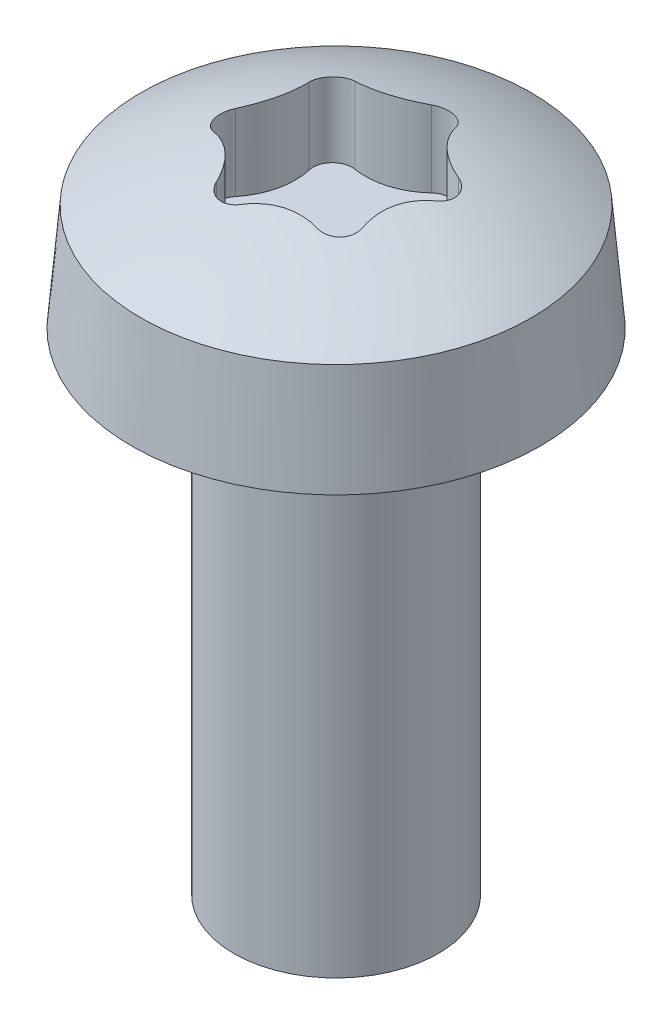
ISO-10303-21;
HEADER;
FILE_DESCRIPTION(('STEP AP214'),'2;1');
FILE_NAME('part.step','',(''),(''),'','','');
FILE_SCHEMA(('AUTOMOTIVE_DESIGN { 1 0 10303 214 1 1 1 1 }'));
ENDSEC;
DATA;
#1=APPLICATION_CONTEXT('core data for automotive mechanical design processes');
#2=APPLICATION_PROTOCOL_DEFINITION('international standard','automotive_design',2000,#1);
#3=PRODUCT_CONTEXT('',#1,'mechanical');
#4=PRODUCT('Part','Part','',(#3));
#5=PRODUCT_RELATED_PRODUCT_CATEGORY('part','',(#4));
#6=PRODUCT_DEFINITION_FORMATION('','',#4);
#7=PRODUCT_DEFINITION_CONTEXT('part definition',#1,'design');
#8=PRODUCT_DEFINITION('design','',#6,#7);
#9=PRODUCT_DEFINITION_SHAPE('','',#8);
#10=(LENGTH_UNIT() NAMED_UNIT(*) SI_UNIT(.MILLI.,.METRE.));
#11=(NAMED_UNIT(*) PLANE_ANGLE_UNIT() SI_UNIT($,.RADIAN.));
#12=(NAMED_UNIT(*) SI_UNIT($,.STERADIAN.) SOLID_ANGLE_UNIT());
#13=UNCERTAINTY_MEASURE_WITH_UNIT(LENGTH_MEASURE(1.E-05),#10,'distance_accuracy_value','');
#14=(GEOMETRIC_REPRESENTATION_CONTEXT(3) GLOBAL_UNCERTAINTY_ASSIGNED_CONTEXT((#13)) GLOBAL_UNIT_ASSIGNED_CONTEXT((#10,
#11,#12)) REPRESENTATION_CONTEXT('',''));
#15=CARTESIAN_POINT('',(0.,0.,0.));
#16=DIRECTION('',(0.,0.,1.));
#17=DIRECTION('',(1.,0.,0.));
#18=AXIS2_PLACEMENT_3D('',#15,#16,#17);
#19=CARTESIAN_POINT('',(1.21685955673457,0.902893401215986,-1.23346096370369));
#20=DIRECTION('',(0.,-1.,0.));
#21=DIRECTION('',(0.,0.,-1.));
#22=AXIS2_PLACEMENT_3D('',#19,#20,#21);
#23=PLANE('',#22);
#24=CARTESIAN_POINT('',(1.76235130234408,0.902893401215986,0.412600443438467));
#25=DIRECTION('',(0.,1.,0.));
#26=DIRECTION('',(-1.,0.,0.));
#27=AXIS2_PLACEMENT_3D('',#24,#25,#26);
#28=CIRCLE('',#27,0.850000000000003);
#29=CARTESIAN_POINT('',(1.10462489664174,0.902893401215986,-0.125819444048884));
#30=VERTEX_POINT('',#29);
#31=CARTESIAN_POINT('',(0.93397211621467,0.902893401215986,0.603094338321163));
#32=VERTEX_POINT('',#31);
#33=EDGE_CURVE('E264',#30,#32,#28,.T.);
#34=ORIENTED_EDGE('',*,*,#33,.F.);
#35=CARTESIAN_POINT('',(0.918913911502263,0.902893401215986,-0.277843882868843));
#36=DIRECTION('',(0.,-1.,0.));
#37=DIRECTION('',(1.,0.,0.));
#38=AXIS2_PLACEMENT_3D('',#35,#36,#37);
#39=CIRCLE('',#38,0.24);
#40=CARTESIAN_POINT('',(0.989281075972035,0.902893401215986,-0.507296409907627));
#41=VERTEX_POINT('',#40);
#42=EDGE_CURVE('E267',#30,#41,#39,.F.);
#43=ORIENTED_EDGE('',*,*,#42,.T.);
#44=CARTESIAN_POINT('',(1.23849811680248,0.902893401215986,-1.31994077650332));
#45=DIRECTION('',(0.,1.,0.));
#46=DIRECTION('',(0.,0.,1.));
#47=AXIS2_PLACEMENT_3D('',#44,#45,#46);
#48=CIRCLE('',#47,0.850000000000002);
#49=CARTESIAN_POINT('',(0.44334961348451,0.902893401215986,-1.01954294416894));
#50=VERTEX_POINT('',#49);
#51=EDGE_CURVE('E270',#50,#41,#48,.T.);
#52=ORIENTED_EDGE('',*,*,#51,.F.);
#53=CARTESIAN_POINT('',(0.218837094900614,0.902893401215986,-0.934724732686294));
#54=DIRECTION('',(0.,-1.,0.));
#55=DIRECTION('',(0.,0.,-1.));
#56=AXIS2_PLACEMENT_3D('',#53,#54,#55);
#57=CIRCLE('',#56,0.24);
#58=CARTESIAN_POINT('',(0.0553089597573758,0.902893401215986,-1.11039074822879));
#59=VERTEX_POINT('',#58);
#60=EDGE_CURVE('E274',#50,#59,#57,.F.);
#61=ORIENTED_EDGE('',*,*,#60,.T.);
#62=CARTESIAN_POINT('',(-0.523853185541587,0.902893401215986,-1.73254121994176));
#63=DIRECTION('',(0.,1.,0.));
#64=DIRECTION('',(0.,0.,1.));
#65=AXIS2_PLACEMENT_3D('',#62,#63,#64);
#66=CIRCLE('',#65,0.849999999999981);
#67=CARTESIAN_POINT('',(-0.661275283157223,0.902893401215986,-0.893723500120056));
#68=VERTEX_POINT('',#67);
#69=EDGE_CURVE('E277',#68,#59,#66,.T.);
#70=ORIENTED_EDGE('',*,*,#69,.F.);
#71=CARTESIAN_POINT('',(-0.700076816601636,0.902893401215986,-0.656880849817454));
#72=DIRECTION('',(0.,-1.,0.));
#73=DIRECTION('',(1.,0.,0.));
#74=AXIS2_PLACEMENT_3D('',#71,#72,#73);
#75=CIRCLE('',#74,0.24);
#76=CARTESIAN_POINT('',(-0.933972116214645,0.902893401215986,-0.603094338321165));
#77=VERTEX_POINT('',#76);
#78=EDGE_CURVE('E281',#68,#77,#75,.F.);
#79=ORIENTED_EDGE('',*,*,#78,.T.);
#80=CARTESIAN_POINT('',(-1.76235130234408,0.902893401215985,-0.412600443438476));
#81=DIRECTION('',(0.,1.,0.));
#82=DIRECTION('',(-1.,0.,0.));
#83=AXIS2_PLACEMENT_3D('',#80,#81,#82);
#84=CIRCLE('',#83,0.850000000000023);
#85=CARTESIAN_POINT('',(-1.10462489664172,0.902893401215986,0.125819444048882));
#86=VERTEX_POINT('',#85);
#87=EDGE_CURVE('E284',#86,#77,#84,.T.);
#88=ORIENTED_EDGE('',*,*,#87,.F.);
#89=CARTESIAN_POINT('',(-0.918913911502237,0.902893401215986,0.27784388286884));
#90=DIRECTION('',(0.,-1.,0.));
#91=DIRECTION('',(1.,0.,0.));
#92=AXIS2_PLACEMENT_3D('',#89,#90,#91);
#93=CIRCLE('',#92,0.24);
#94=CARTESIAN_POINT('',(-0.989281075972011,0.902893401215986,0.507296409907623));
#95=VERTEX_POINT('',#94);
#96=EDGE_CURVE('E288',#86,#95,#93,.F.);
#97=ORIENTED_EDGE('',*,*,#96,.T.);
#98=CARTESIAN_POINT('',(-1.23849811680245,0.902893401215986,1.31994077650331));
#99=DIRECTION('',(0.,1.,0.));
#100=DIRECTION('',(0.,0.,1.));
#101=AXIS2_PLACEMENT_3D('',#98,#99,#100);
#102=CIRCLE('',#101,0.849999999999989);
#103=CARTESIAN_POINT('',(-0.443349613484488,0.902893401215986,1.01954294416894));
#104=VERTEX_POINT('',#103);
#105=EDGE_CURVE('E291',#104,#95,#102,.T.);
#106=ORIENTED_EDGE('',*,*,#105,.F.);
#107=CARTESIAN_POINT('',(-0.218837094900589,0.902893401215986,0.934724732686296));
#108=DIRECTION('',(0.,-1.,0.));
#109=DIRECTION('',(0.,0.,-1.));
#110=AXIS2_PLACEMENT_3D('',#107,#108,#109);
#111=CIRCLE('',#110,0.24);
#112=CARTESIAN_POINT('',(-0.0553089597573533,0.902893401215986,1.11039074822879));
#113=VERTEX_POINT('',#112);
#114=EDGE_CURVE('E117',#104,#113,#111,.F.);
#115=ORIENTED_EDGE('',*,*,#114,.T.);
#116=CARTESIAN_POINT('',(0.523853185541608,0.902893401215985,1.73254121994178));
#117=DIRECTION('',(0.,1.,0.));
#118=DIRECTION('',(0.,0.,1.));
#119=AXIS2_PLACEMENT_3D('',#116,#117,#118);
#120=CIRCLE('',#119,0.849999999999997);
#121=CARTESIAN_POINT('',(0.661275283157243,0.902893401215986,0.893723500120061));
#122=VERTEX_POINT('',#121);
#123=EDGE_CURVE('E115',#122,#113,#120,.T.);
#124=ORIENTED_EDGE('',*,*,#123,.F.);
#125=CARTESIAN_POINT('',(0.700076816601659,0.902893401215986,0.656880849817456));
#126=DIRECTION('',(0.,-1.,0.));
#127=DIRECTION('',(1.,0.,0.));
#128=AXIS2_PLACEMENT_3D('',#125,#126,#127);
#129=CIRCLE('',#128,0.240000000000003);
#130=EDGE_CURVE('E21',#122,#32,#129,.F.);
#131=ORIENTED_EDGE('',*,*,#130,.T.);
#132=EDGE_LOOP('',(#34,#43,#52,#61,#70,#79,#88,#97,#106,#115,#124,#131));
#133=FACE_BOUND('',#132,.T.);
#134=ADVANCED_FACE('F16',(#133),#23,.F.);
#135=CARTESIAN_POINT('',(0.700076816601659,1.85249936961155,0.656880849817456));
#136=DIRECTION('',(0.,-1.,0.));
#137=DIRECTION('',(1.,0.,0.));
#138=AXIS2_PLACEMENT_3D('',#135,#136,#137);
#139=CYLINDRICAL_SURFACE('',#138,0.240000000000003);
#140=ORIENTED_EDGE('',*,*,#130,.F.);
#141=DIRECTION('',(0.,1.,0.));
#142=VECTOR('',#141,1.);
#143=CARTESIAN_POINT('',(0.661275283157244,0.902893401215986,0.893723500120058));
#144=LINE('',#143,#142);
#145=CARTESIAN_POINT('',(0.661275283157244,1.8357889216555,0.893723500120058));
#146=VERTEX_POINT('',#145);
#147=EDGE_CURVE('E108',#146,#122,#144,.F.);
#148=ORIENTED_EDGE('',*,*,#147,.F.);
#149=CARTESIAN_POINT('',(0.933972116214671,1.8357889216555,0.603094338321163));
#150=CARTESIAN_POINT('',(0.936978659676036,1.8332459720987,0.616117371502093));
#151=CARTESIAN_POINT('',(0.938881712635089,1.8308451458285,0.629424010006071));
#152=CARTESIAN_POINT('',(0.940448198049544,1.8263901319178,0.656229072225864));
#153=CARTESIAN_POINT('',(0.940111049859225,1.82433603428861,0.669727544759083));
#154=CARTESIAN_POINT('',(0.937161311976297,1.82063626069102,0.696548150559742));
#155=CARTESIAN_POINT('',(0.934546270329319,1.81899102728298,0.709870078099456));
#156=CARTESIAN_POINT('',(0.927092196382292,1.81616419595116,0.735920969215229));
#157=CARTESIAN_POINT('',(0.922254454795389,1.81498232968908,0.74865027220785));
#158=CARTESIAN_POINT('',(0.910580086867436,1.8131357977715,0.772926933541809));
#159=CARTESIAN_POINT('',(0.90377922213591,1.8124625970035,0.784490838165586));
#160=CARTESIAN_POINT('',(0.888334690836333,1.81162207566531,0.806339696014131));
#161=CARTESIAN_POINT('',(0.879690674143791,1.81145485130202,0.816624405654939));
#162=CARTESIAN_POINT('',(0.860952806778858,1.81163076364021,0.835466574167904));
#163=CARTESIAN_POINT('',(0.850882293164684,1.81196638773676,0.844047332017603));
#164=CARTESIAN_POINT('',(0.829491408593781,1.81312334938266,0.859427997341865));
#165=CARTESIAN_POINT('',(0.818171343052326,1.81394456845584,0.86622833862141));
#166=CARTESIAN_POINT('',(0.794597695990642,1.81604757722792,0.877875886612411));
#167=CARTESIAN_POINT('',(0.782343413411394,1.81732971554648,0.882721609030603));
#168=CARTESIAN_POINT('',(0.757251332857759,1.8203160292444,0.890339748796462));
#169=CARTESIAN_POINT('',(0.7444133601806,1.82202033166862,0.893111541010024));
#170=CARTESIAN_POINT('',(0.719774320317228,1.82561678584645,0.896361486884844));
#171=CARTESIAN_POINT('',(0.707993543587,1.82747465269123,0.897036137621287));
#172=CARTESIAN_POINT('',(0.684513586548248,1.83144863833865,0.896664651650928));
#173=CARTESIAN_POINT('',(0.672814342283748,1.83356452294265,0.895620064861463));
#174=CARTESIAN_POINT('',(0.661275283157243,1.8357889216555,0.893723500120064));
#175=B_SPLINE_CURVE_WITH_KNOTS('',3,(#149,#150,#151,#152,#153,#154,#155,#156,#157,#158,#159,
#160,#161,#162,#163,#164,#165,#166,#167,#168,#169,#170,#171,#172,#173,#174),.UNSPECIFIED.,.F.,
.F.,(4,2,2,2,2,2,2,2,2,2,2,2,4),(0.,0.0407718082662824,0.0815541847350141,0.122380514211011,
0.163183165903276,0.203284961873774,0.243394382364424,0.28291050960035,0.322416999608621,
0.36195343372601,0.4015017803116,0.437211821548792,0.472889687300924),.UNSPECIFIED.);
#176=CARTESIAN_POINT('',(0.93397211621467,1.8357889216555,0.603094338321163));
#177=VERTEX_POINT('',#176);
#178=EDGE_CURVE('E258',#177,#146,#175,.T.);
#179=ORIENTED_EDGE('',*,*,#178,.F.);
#180=DIRECTION('',(0.,1.,0.));
#181=VECTOR('',#180,1.);
#182=CARTESIAN_POINT('',(0.933972116214669,0.902893401215986,0.603094338321163));
#183=LINE('',#182,#181);
#184=EDGE_CURVE('E110',#32,#177,#183,.T.);
#185=ORIENTED_EDGE('',*,*,#184,.F.);
#186=EDGE_LOOP('',(#140,#148,#179,#185));
#187=FACE_BOUND('',#186,.T.);
#188=ADVANCED_FACE('F106',(#187),#139,.F.);
#189=CARTESIAN_POINT('',(0.523853185541608,0.902893401215985,1.73254121994178));
#190=DIRECTION('',(0.,1.,0.));
#191=DIRECTION('',(0.,0.,1.));
#192=AXIS2_PLACEMENT_3D('',#189,#190,#191);
#193=CYLINDRICAL_SURFACE('',#192,0.849999999999997);
#194=DIRECTION('',(0.,-1.,0.));
#195=VECTOR('',#194,1.);
#196=CARTESIAN_POINT('',(-0.0553089597573543,1.85249936961326,1.11039074822879));
#197=LINE('',#196,#195);
#198=CARTESIAN_POINT('',(-0.0553089597576975,1.83578892165541,1.11039074822911));
#199=VERTEX_POINT('',#198);
#200=EDGE_CURVE('E126',#113,#199,#197,.F.);
#201=ORIENTED_EDGE('',*,*,#200,.T.);
#202=CARTESIAN_POINT('',(0.661275283157244,1.8357889216555,0.893723500120058));
#203=CARTESIAN_POINT('',(0.637914011702394,1.84029003286391,0.889896405602767));
#204=CARTESIAN_POINT('',(0.614335442214769,1.84442649605071,0.887036615956517));
#205=CARTESIAN_POINT('',(0.566893371567763,1.85192640078673,0.883297536447727));
#206=CARTESIAN_POINT('',(0.543029788346318,1.85528961376537,0.882418831514078));
#207=CARTESIAN_POINT('',(0.471413409426745,1.86413076990032,0.882824887251152));
#208=CARTESIAN_POINT('',(0.423480262605824,1.86839021628381,0.887126239718086));
#209=CARTESIAN_POINT('',(0.331855429025833,1.87321872219443,0.903283753323642));
#210=CARTESIAN_POINT('',(0.288086190741633,1.87400233266487,0.914649551947591));
#211=CARTESIAN_POINT('',(0.202961186524271,1.87242561230019,0.944154341763084));
#212=CARTESIAN_POINT('',(0.161604159661501,1.87006693967874,0.962289756927188));
#213=CARTESIAN_POINT('',(0.0897371717871045,1.86304795258852,1.00083757022035));
#214=CARTESIAN_POINT('',(0.0586241396655876,1.85888555329799,1.02023234517023));
#215=CARTESIAN_POINT('',(-0.000668625170523298,1.84869779170737,1.06268033561732));
#216=CARTESIAN_POINT('',(-0.0288481419881894,1.84267229241872,1.08573382006855));
#217=CARTESIAN_POINT('',(-0.0553089597576998,1.83578892165541,1.11039074822911));
#218=B_SPLINE_CURVE_WITH_KNOTS('',3,(#202,#203,#204,#205,#206,#207,#208,#209,#210,#211,#212,
#213,#214,#215,#216,#217),.UNSPECIFIED.,.F.,.F.,(4,2,2,2,2,2,2,4),(0.,0.0722434043128031,
0.144508136195889,0.288565472923462,0.423594576724947,0.558552452559671,0.668910093683834,
0.779275851028292),.UNSPECIFIED.);
#219=EDGE_CURVE('E122',#146,#199,#218,.T.);
#220=ORIENTED_EDGE('',*,*,#219,.F.);
#221=ORIENTED_EDGE('',*,*,#147,.T.);
#222=ORIENTED_EDGE('',*,*,#123,.T.);
#223=EDGE_LOOP('',(#201,#220,#221,#222));
#224=FACE_BOUND('',#223,.T.);
#225=ADVANCED_FACE('F120',(#224),#193,.T.);
#226=CARTESIAN_POINT('',(-0.218837094900589,1.85249936961326,0.934724732686296));
#227=DIRECTION('',(0.,-1.,0.));
#228=DIRECTION('',(0.,0.,-1.));
#229=AXIS2_PLACEMENT_3D('',#226,#227,#228);
#230=CYLINDRICAL_SURFACE('',#229,0.24);
#231=ORIENTED_EDGE('',*,*,#114,.F.);
#232=DIRECTION('',(0.,1.,0.));
#233=VECTOR('',#232,1.);
#234=CARTESIAN_POINT('',(-0.443349613484489,0.902893401215986,1.01954294416894));
#235=LINE('',#234,#233);
#236=CARTESIAN_POINT('',(-0.443349613484489,1.8357889216555,1.01954294416894));
#237=VERTEX_POINT('',#236);
#238=EDGE_CURVE('E294',#237,#104,#235,.F.);
#239=ORIENTED_EDGE('',*,*,#238,.F.);
#240=CARTESIAN_POINT('',(-0.0553089597576989,1.83578892165541,1.11039074822911));
#241=CARTESIAN_POINT('',(-0.0650839655960465,1.83324597209861,1.11950600783468));
#242=CARTESIAN_POINT('',(-0.0756563260999564,1.83084514582842,1.12780741929393));
#243=CARTESIAN_POINT('',(-0.0980869482251186,1.82639013191773,1.14256656656736));
#244=CARTESIAN_POINT('',(-0.109945542446343,1.82433603428854,1.14902382393629));
#245=CARTESIAN_POINT('',(-0.134647737356084,1.82063626069096,1.15987957889545));
#246=CARTESIAN_POINT('',(-0.147492385856349,1.81899102728293,1.16427585016704));
#247=CARTESIAN_POINT('',(-0.173780156327353,1.81616419595111,1.17084587832507));
#248=CARTESIAN_POINT('',(-0.187222926884886,1.81498232968904,1.17302092271015));
#249=CARTESIAN_POINT('',(-0.214084316283144,1.81313579777147,1.17504895417834));
#250=CARTESIAN_POINT('',(-0.227499383820037,1.81246259700348,1.174941184865));
#251=CARTESIAN_POINT('',(-0.254143315410332,1.8116220756653,1.17249025733425));
#252=CARTESIAN_POINT('',(-0.267372143576083,1.81145485130202,1.17014667410815));
#253=CARTESIAN_POINT('',(-0.293058873853149,1.81163076364022,1.16334028921381));
#254=CARTESIAN_POINT('',(-0.305525284941789,1.81196638773677,1.1589093475196));
#255=CARTESIAN_POINT('',(-0.329540774125137,1.81312334938269,1.14807463073387));
#256=CARTESIAN_POINT('',(-0.341090075198341,1.81394456845587,1.14167133704221));
#257=CARTESIAN_POINT('',(-0.36296397118116,1.81604757722797,1.12707973382241));
#258=CARTESIAN_POINT('',(-0.373287631184611,1.81732971554653,1.1188900750127));
#259=CARTESIAN_POINT('',(-0.392431174028209,1.82031602924445,1.10096876570234));
#260=CARTESIAN_POINT('',(-0.401250602837728,1.82202033166868,1.0912366513376));
#261=CARTESIAN_POINT('',(-0.41638465845785,1.82561678584651,1.0715235898285));
#262=CARTESIAN_POINT('',(-0.422859311499351,1.82747465269128,1.06165846327209));
#263=CARTESIAN_POINT('',(-0.434277573731155,1.83144863833868,1.0411384810117));
#264=CARTESIAN_POINT('',(-0.439222557167235,1.83356452294267,1.03048434487889));
#265=CARTESIAN_POINT('',(-0.443349613484488,1.8357889216555,1.01954294416894));
#266=B_SPLINE_CURVE_WITH_KNOTS('',3,(#240,#241,#242,#243,#244,#245,#246,#247,#248,#249,#250,
#251,#252,#253,#254,#255,#256,#257,#258,#259,#260,#261,#262,#263,#264,#265),.UNSPECIFIED.,.F.,
.F.,(4,2,2,2,2,2,2,2,2,2,2,2,4),(0.,0.040771808266276,0.0815541847350012,0.122380514210991,
0.16318316590325,0.203284961873742,0.243394382364387,0.282910509600311,0.32241699960858,
0.36195343372597,0.401501780311562,0.437211821548532,0.47288968730044),.UNSPECIFIED.);
#267=EDGE_CURVE('E233',#199,#237,#266,.T.);
#268=ORIENTED_EDGE('',*,*,#267,.F.);
#269=ORIENTED_EDGE('',*,*,#200,.F.);
#270=EDGE_LOOP('',(#231,#239,#268,#269));
#271=FACE_BOUND('',#270,.T.);
#272=ADVANCED_FACE('F243',(#271),#230,.F.);
#273=CARTESIAN_POINT('',(-1.23849811680245,0.902893401215986,1.31994077650331));
#274=DIRECTION('',(0.,1.,0.));
#275=DIRECTION('',(0.,0.,1.));
#276=AXIS2_PLACEMENT_3D('',#273,#274,#275);
#277=CYLINDRICAL_SURFACE('',#276,0.849999999999989);
#278=DIRECTION('',(0.,-1.,0.));
#279=VECTOR('',#278,1.);
#280=CARTESIAN_POINT('',(-0.989281075972015,1.85249936961155,0.507296409907623));
#281=LINE('',#280,#279);
#282=CARTESIAN_POINT('',(-0.989281075972015,1.8357889216555,0.507296409907623));
#283=VERTEX_POINT('',#282);
#284=EDGE_CURVE('E290',#95,#283,#281,.F.);
#285=ORIENTED_EDGE('',*,*,#284,.T.);
#286=CARTESIAN_POINT('',(-0.443349613484489,1.8357889216555,1.01954294416894));
#287=CARTESIAN_POINT('',(-0.451715888137255,1.84029003286392,0.997397942365691));
#288=CARTESIAN_POINT('',(-0.461028522397935,1.84442649605071,0.975548407381386));
#289=CARTESIAN_POINT('',(-0.481511419880057,1.85192640078673,0.932592829238547));
#290=CARTESIAN_POINT('',(-0.492682230695809,1.85528961376537,0.911487007476627));
#291=CARTESIAN_POINT('',(-0.528842074739253,1.86413076990032,0.849668431873762));
#292=CARTESIAN_POINT('',(-0.55653372865671,1.86839021628381,0.810307785276981));
#293=CARTESIAN_POINT('',(-0.616338962691109,1.87321872219443,0.739037108581965));
#294=CARTESIAN_POINT('',(-0.648066652175847,1.87400233266487,0.706814735635529));
#295=CARTESIAN_POINT('',(-0.716181051798064,1.87242561230019,0.647846714393783));
#296=CARTESIAN_POINT('',(-0.752565295469741,1.87006693967874,0.621098186087681));
#297=CARTESIAN_POINT('',(-0.821882174979086,1.86304795258853,0.578133455541606));
#298=CARTESIAN_POINT('',(-0.854235058847056,1.85888555329801,0.560886166810587));
#299=CARTESIAN_POINT('',(-0.920642479331734,1.84869779170741,0.530761121425486));
#300=CARTESIAN_POINT('',(-0.954697140921003,1.84267229241878,0.517883686220645));
#301=CARTESIAN_POINT('',(-0.989281075972017,1.8357889216555,0.507296409907624));
#302=B_SPLINE_CURVE_WITH_KNOTS('',3,(#286,#287,#288,#289,#290,#291,#292,#293,#294,#295,#296,
#297,#298,#299,#300,#301),.UNSPECIFIED.,.F.,.F.,(4,2,2,2,2,2,2,4),(0.,0.0722434043128028,
0.144508136195888,0.288565472923463,0.423594576724946,0.558552452559668,0.668910093683595,
0.779275851027814),.UNSPECIFIED.);
#303=EDGE_CURVE('E226',#237,#283,#302,.T.);
#304=ORIENTED_EDGE('',*,*,#303,.F.);
#305=ORIENTED_EDGE('',*,*,#238,.T.);
#306=ORIENTED_EDGE('',*,*,#105,.T.);
#307=EDGE_LOOP('',(#285,#304,#305,#306));
#308=FACE_BOUND('',#307,.T.);
#309=ADVANCED_FACE('F240',(#308),#277,.T.);
#310=CARTESIAN_POINT('',(-0.918913911502238,1.85249936961155,0.27784388286884));
#311=DIRECTION('',(0.,-1.,0.));
#312=DIRECTION('',(1.,0.,0.));
#313=AXIS2_PLACEMENT_3D('',#310,#311,#312);
#314=CYLINDRICAL_SURFACE('',#313,0.24);
#315=ORIENTED_EDGE('',*,*,#96,.F.);
#316=DIRECTION('',(0.,1.,0.));
#317=VECTOR('',#316,1.);
#318=CARTESIAN_POINT('',(-1.10462489664172,0.902893401215985,0.12581944404888));
#319=LINE('',#318,#317);
#320=CARTESIAN_POINT('',(-1.10462489664172,1.8357889216555,0.12581944404888));
#321=VERTEX_POINT('',#320);
#322=EDGE_CURVE('E287',#321,#86,#319,.F.);
#323=ORIENTED_EDGE('',*,*,#322,.F.);
#324=CARTESIAN_POINT('',(-0.989281075972016,1.8357889216555,0.507296409907623));
#325=CARTESIAN_POINT('',(-1.00206262527171,1.8332459720987,0.503388636332281));
#326=CARTESIAN_POINT('',(-1.01453803873466,1.8308451458285,0.498383409287579));
#327=CARTESIAN_POINT('',(-1.03853514627425,1.8263901319178,0.486337494341258));
#328=CARTESIAN_POINT('',(-1.05005659230514,1.82433603428861,0.479296279176993));
#329=CARTESIAN_POINT('',(-1.07180904933194,1.82063626069102,0.463331428335541));
#330=CARTESIAN_POINT('',(-1.08203865618522,1.81899102728298,0.454405772067446));
#331=CARTESIAN_POINT('',(-1.10087235270918,1.81616419595116,0.434924909109747));
#332=CARTESIAN_POINT('',(-1.10947738167981,1.81498232968908,0.424370650502234));
#333=CARTESIAN_POINT('',(-1.12466440315011,1.8131357977715,0.40212202063652));
#334=CARTESIAN_POINT('',(-1.13127860595548,1.8124625970035,0.390450346699429));
#335=CARTESIAN_POINT('',(-1.14247800624621,1.81162207566531,0.366150561320179));
#336=CARTESIAN_POINT('',(-1.14706281771942,1.81145485130202,0.353522268453297));
#337=CARTESIAN_POINT('',(-1.15401168063157,1.81163076364022,0.32787371504604));
#338=CARTESIAN_POINT('',(-1.15640757810604,1.81196638773676,0.314862015502159));
#339=CARTESIAN_POINT('',(-1.15903218271851,1.81312334938266,0.288646633392205));
#340=CARTESIAN_POINT('',(-1.15926141825027,1.81394456845584,0.275442998421027));
#341=CARTESIAN_POINT('',(-1.15756166717143,1.81604757722793,0.249203847210261));
#342=CARTESIAN_POINT('',(-1.15563104459565,1.81732971554649,0.236168465982383));
#343=CARTESIAN_POINT('',(-1.14968250688565,1.8203160292444,0.210629016906201));
#344=CARTESIAN_POINT('',(-1.14566396301802,1.82202033166863,0.198125110327909));
#345=CARTESIAN_POINT('',(-1.13615897877486,1.82561678584646,0.175162102943964));
#346=CARTESIAN_POINT('',(-1.13085285508618,1.82747465269123,0.164622325651054));
#347=CARTESIAN_POINT('',(-1.11879116027933,1.83144863833865,0.144473829360909));
#348=CARTESIAN_POINT('',(-1.11203689945095,1.83356452294265,0.134864280017506));
#349=CARTESIAN_POINT('',(-1.10462489664172,1.8357889216555,0.125819444048883));
#350=B_SPLINE_CURVE_WITH_KNOTS('',3,(#324,#325,#326,#327,#328,#329,#330,#331,#332,#333,#334,
#335,#336,#337,#338,#339,#340,#341,#342,#343,#344,#345,#346,#347,#348,#349),.UNSPECIFIED.,.F.,
.F.,(4,2,2,2,2,2,2,2,2,2,2,2,4),(0.,0.0407718082662819,0.0815541847350131,0.122380514211009,
0.163183165903274,0.203284961873771,0.24339438236442,0.282910509600346,0.322416999608617,
0.361953433726005,0.401501780311595,0.437211821548783,0.47288968730091),.UNSPECIFIED.);
#351=EDGE_CURVE('E219',#283,#321,#350,.T.);
#352=ORIENTED_EDGE('',*,*,#351,.F.);
#353=ORIENTED_EDGE('',*,*,#284,.F.);
#354=EDGE_LOOP('',(#315,#323,#352,#353));
#355=FACE_BOUND('',#354,.T.);
#356=ADVANCED_FACE('F208',(#355),#314,.F.);
#357=CARTESIAN_POINT('',(-1.76235130234408,0.902893401215984,-0.412600443438476));
#358=DIRECTION('',(0.,1.,0.));
#359=DIRECTION('',(-1.,0.,0.));
#360=AXIS2_PLACEMENT_3D('',#357,#358,#359);
#361=CYLINDRICAL_SURFACE('',#360,0.850000000000023);
#362=DIRECTION('',(0.,-1.,0.));
#363=VECTOR('',#362,1.);
#364=CARTESIAN_POINT('',(-0.933972116214645,1.85249936961326,-0.603094338321164));
#365=LINE('',#364,#363);
#366=CARTESIAN_POINT('',(-0.933972116214753,1.83578892165541,-0.603094338321631));
#367=VERTEX_POINT('',#366);
#368=EDGE_CURVE('E283',#77,#367,#365,.F.);
#369=ORIENTED_EDGE('',*,*,#368,.T.);
#370=CARTESIAN_POINT('',(-1.10462489664172,1.8357889216555,0.12581944404888));
#371=CARTESIAN_POINT('',(-1.08962989983964,1.84029003286391,0.107501536762921));
#372=CARTESIAN_POINT('',(-1.0753639646127,1.84442649605071,0.088511791424866));
#373=CARTESIAN_POINT('',(-1.04840479144781,1.85192640078673,0.0492952927908167));
#374=CARTESIAN_POINT('',(-1.03571201904212,1.85528961376537,0.0290681759625457));
#375=CARTESIAN_POINT('',(-1.00025548416599,1.86413076990031,-0.0331564553773941));
#376=CARTESIAN_POINT('',(-0.980013991262526,1.86839021628381,-0.0768184544411087));
#377=CARTESIAN_POINT('',(-0.948194391716934,1.87321872219443,-0.164246644741681));
#378=CARTESIAN_POINT('',(-0.936152842917472,1.87400233266487,-0.207834816312069));
#379=CARTESIAN_POINT('',(-0.919142238322328,1.87242561230019,-0.29630762736931));
#380=CARTESIAN_POINT('',(-0.914169455131235,1.87006693967874,-0.341191570839518));
#381=CARTESIAN_POINT('',(-0.911619346766251,1.86304795258852,-0.422704114678795));
#382=CARTESIAN_POINT('',(-0.912859198512777,1.85888555329799,-0.459346178359734));
#383=CARTESIAN_POINT('',(-0.919973854161495,1.84869779170736,-0.531919214191967));
#384=CARTESIAN_POINT('',(-0.925848998933176,1.84267229241871,-0.567850133848052));
#385=CARTESIAN_POINT('',(-0.933972116214758,1.83578892165541,-0.603094338321642));
#386=B_SPLINE_CURVE_WITH_KNOTS('',3,(#370,#371,#372,#373,#374,#375,#376,#377,#378,#379,#380,
#381,#382,#383,#384,#385),.UNSPECIFIED.,.F.,.F.,(4,2,2,2,2,2,2,4),(0.,0.0722434043128033,
0.144508136195889,0.288565472923463,0.423594576724951,0.558552452559679,0.668910093683846,
0.779275851028306),.UNSPECIFIED.);
#387=EDGE_CURVE('E212',#321,#367,#386,.T.);
#388=ORIENTED_EDGE('',*,*,#387,.F.);
#389=ORIENTED_EDGE('',*,*,#322,.T.);
#390=ORIENTED_EDGE('',*,*,#87,.T.);
#391=EDGE_LOOP('',(#369,#388,#389,#390));
#392=FACE_BOUND('',#391,.T.);
#393=ADVANCED_FACE('F203',(#392),#361,.T.);
#394=CARTESIAN_POINT('',(-0.700076816601636,1.85249936961326,-0.656880849817454));
#395=DIRECTION('',(0.,-1.,0.));
#396=DIRECTION('',(1.,0.,0.));
#397=AXIS2_PLACEMENT_3D('',#394,#395,#396);
#398=CYLINDRICAL_SURFACE('',#397,0.24);
#399=ORIENTED_EDGE('',*,*,#78,.F.);
#400=DIRECTION('',(0.,1.,0.));
#401=VECTOR('',#400,1.);
#402=CARTESIAN_POINT('',(-0.661275283157225,0.902893401215986,-0.893723500120054));
#403=LINE('',#402,#401);
#404=CARTESIAN_POINT('',(-0.661275283157225,1.8357889216555,-0.893723500120055));
#405=VERTEX_POINT('',#404);
#406=EDGE_CURVE('E280',#405,#68,#403,.F.);
#407=ORIENTED_EDGE('',*,*,#406,.F.);
#408=CARTESIAN_POINT('',(-0.933972116214756,1.83578892165541,-0.603094338321643));
#409=CARTESIAN_POINT('',(-0.936978659676093,1.83324597209861,-0.616117371502578));
#410=CARTESIAN_POINT('',(-0.938881712635119,1.83084514582841,-0.629424010006558));
#411=CARTESIAN_POINT('',(-0.940448198049519,1.82639013191773,-0.656229072226351));
#412=CARTESIAN_POINT('',(-0.940111049859173,1.82433603428854,-0.669727544759568));
#413=CARTESIAN_POINT('',(-0.937161311976191,1.82063626069096,-0.696548150560218));
#414=CARTESIAN_POINT('',(-0.934546270329186,1.81899102728292,-0.709870078099926));
#415=CARTESIAN_POINT('',(-0.927092196382108,1.81616419595111,-0.73592096921568));
#416=CARTESIAN_POINT('',(-0.92225445479518,1.81498232968904,-0.74865027220829));
#417=CARTESIAN_POINT('',(-0.91058008686718,1.81313579777148,-0.772926933542223));
#418=CARTESIAN_POINT('',(-0.903779222135632,1.81246259700348,-0.784490838165986));
#419=CARTESIAN_POINT('',(-0.888334690836014,1.8116220756653,-0.806339696014497));
#420=CARTESIAN_POINT('',(-0.879690674143453,1.81145485130202,-0.816624405655286));
#421=CARTESIAN_POINT('',(-0.860952806778485,1.81163076364022,-0.835466574168213));
#422=CARTESIAN_POINT('',(-0.850882293164295,1.81196638773677,-0.844047332017892));
#423=CARTESIAN_POINT('',(-0.829491408593364,1.81312334938269,-0.859427997342112));
#424=CARTESIAN_POINT('',(-0.818171343051897,1.81394456845587,-0.866228338621634));
#425=CARTESIAN_POINT('',(-0.794597695990191,1.81604757722797,-0.877875886612588));
#426=CARTESIAN_POINT('',(-0.782343413410934,1.81732971554653,-0.882721609030757));
#427=CARTESIAN_POINT('',(-0.757251332857284,1.82031602924446,-0.890339748796568));
#428=CARTESIAN_POINT('',(-0.744413360180119,1.82202033166869,-0.893111541010105));
#429=CARTESIAN_POINT('',(-0.71977432031682,1.82561678584652,-0.896361486884866));
#430=CARTESIAN_POINT('',(-0.707993543586669,1.82747465269128,-0.897036137621288));
#431=CARTESIAN_POINT('',(-0.684513586548074,1.83144863833868,-0.896664651650909));
#432=CARTESIAN_POINT('',(-0.672814342283652,1.83356452294267,-0.895620064861446));
#433=CARTESIAN_POINT('',(-0.661275283157225,1.8357889216555,-0.893723500120059));
#434=B_SPLINE_CURVE_WITH_KNOTS('',3,(#408,#409,#410,#411,#412,#413,#414,#415,#416,#417,#418,
#419,#420,#421,#422,#423,#424,#425,#426,#427,#428,#429,#430,#431,#432,#433),.UNSPECIFIED.,.F.,
.F.,(4,2,2,2,2,2,2,2,2,2,2,2,4),(0.,0.0407718082662759,0.081554184735001,0.122380514210991,
0.16318316590325,0.203284961873742,0.243394382364386,0.28291050960031,0.322416999608579,
0.361953433725969,0.401501780311561,0.437211821548518,0.472889687300413),.UNSPECIFIED.);
#435=EDGE_CURVE('E188',#367,#405,#434,.T.);
#436=ORIENTED_EDGE('',*,*,#435,.F.);
#437=ORIENTED_EDGE('',*,*,#368,.F.);
#438=EDGE_LOOP('',(#399,#407,#436,#437));
#439=FACE_BOUND('',#438,.T.);
#440=ADVANCED_FACE('F198',(#439),#398,.F.);
#441=CARTESIAN_POINT('',(-0.523853185541587,0.902893401215985,-1.73254121994176));
#442=DIRECTION('',(0.,1.,0.));
#443=DIRECTION('',(0.,0.,1.));
#444=AXIS2_PLACEMENT_3D('',#441,#442,#443);
#445=CYLINDRICAL_SURFACE('',#444,0.849999999999981);
#446=DIRECTION('',(0.,-1.,0.));
#447=VECTOR('',#446,1.);
#448=CARTESIAN_POINT('',(0.0553089597573772,1.85249936961155,-1.11039074822879));
#449=LINE('',#448,#447);
#450=CARTESIAN_POINT('',(0.0553089597573781,1.8357889216555,-1.11039074822879));
#451=VERTEX_POINT('',#450);
#452=EDGE_CURVE('E276',#59,#451,#449,.F.);
#453=ORIENTED_EDGE('',*,*,#452,.T.);
#454=CARTESIAN_POINT('',(-0.661275283157226,1.8357889216555,-0.893723500120055));
#455=CARTESIAN_POINT('',(-0.637914011702376,1.84029003286392,-0.889896405602763));
#456=CARTESIAN_POINT('',(-0.614335442214751,1.84442649605071,-0.887036615956513));
#457=CARTESIAN_POINT('',(-0.566893371567744,1.85192640078673,-0.883297536447723));
#458=CARTESIAN_POINT('',(-0.543029788346299,1.85528961376537,-0.882418831514074));
#459=CARTESIAN_POINT('',(-0.471413409426727,1.86413076990032,-0.882824887251148));
#460=CARTESIAN_POINT('',(-0.423480262605805,1.86839021628381,-0.887126239718082));
#461=CARTESIAN_POINT('',(-0.331855429025814,1.87321872219443,-0.903283753323637));
#462=CARTESIAN_POINT('',(-0.288086190741615,1.87400233266487,-0.914649551947587));
#463=CARTESIAN_POINT('',(-0.202961186524255,1.87242561230019,-0.944154341763079));
#464=CARTESIAN_POINT('',(-0.161604159661486,1.87006693967874,-0.962289756927183));
#465=CARTESIAN_POINT('',(-0.0897371717871582,1.86304795258853,-1.0008375702203));
#466=CARTESIAN_POINT('',(-0.0586241396657051,1.85888555329801,-1.02023234517015));
#467=CARTESIAN_POINT('',(0.000668625170291838,1.84869779170741,-1.06268033561712));
#468=CARTESIAN_POINT('',(0.0288481419879076,1.84267229241878,-1.08573382006829));
#469=CARTESIAN_POINT('',(0.055308959757376,1.8357889216555,-1.11039074822879));
#470=B_SPLINE_CURVE_WITH_KNOTS('',3,(#454,#455,#456,#457,#458,#459,#460,#461,#462,#463,#464,
#465,#466,#467,#468,#469),.UNSPECIFIED.,.F.,.F.,(4,2,2,2,2,2,2,4),(0.,0.0722434043128026,
0.144508136195888,0.288565472923463,0.423594576724945,0.558552452559666,0.668910093683596,
0.779275851027818),.UNSPECIFIED.);
#471=EDGE_CURVE('E181',#405,#451,#470,.T.);
#472=ORIENTED_EDGE('',*,*,#471,.F.);
#473=ORIENTED_EDGE('',*,*,#406,.T.);
#474=ORIENTED_EDGE('',*,*,#69,.T.);
#475=EDGE_LOOP('',(#453,#472,#473,#474));
#476=FACE_BOUND('',#475,.T.);
#477=ADVANCED_FACE('F195',(#476),#445,.T.);
#478=CARTESIAN_POINT('',(0.218837094900614,1.85249936961155,-0.934724732686295));
#479=DIRECTION('',(0.,-1.,0.));
#480=DIRECTION('',(0.,0.,-1.));
#481=AXIS2_PLACEMENT_3D('',#478,#479,#480);
#482=CYLINDRICAL_SURFACE('',#481,0.24);
#483=ORIENTED_EDGE('',*,*,#60,.F.);
#484=DIRECTION('',(0.,1.,0.));
#485=VECTOR('',#484,1.);
#486=CARTESIAN_POINT('',(0.443349613484509,0.902893401215986,-1.01954294416894));
#487=LINE('',#486,#485);
#488=CARTESIAN_POINT('',(0.443349613484509,1.8357889216555,-1.01954294416894));
#489=VERTEX_POINT('',#488);
#490=EDGE_CURVE('E273',#489,#50,#487,.F.);
#491=ORIENTED_EDGE('',*,*,#490,.F.);
#492=CARTESIAN_POINT('',(0.0553089597573784,1.8357889216555,-1.11039074822879));
#493=CARTESIAN_POINT('',(0.0650839655957089,1.8332459720987,-1.11950600783438));
#494=CARTESIAN_POINT('',(0.0756563260996036,1.8308451458285,-1.12780741929365));
#495=CARTESIAN_POINT('',(0.0980869482247391,1.8263901319178,-1.14256656656712));
#496=CARTESIAN_POINT('',(0.109945542445952,1.82433603428861,-1.14902382393608));
#497=CARTESIAN_POINT('',(0.134647737355675,1.82063626069102,-1.15987957889529));
#498=CARTESIAN_POINT('',(0.147492385855933,1.81899102728298,-1.16427585016691));
#499=CARTESIAN_POINT('',(0.173780156326927,1.81616419595116,-1.17084587832498));
#500=CARTESIAN_POINT('',(0.187222926884458,1.81498232968908,-1.17302092271009));
#501=CARTESIAN_POINT('',(0.214084316282714,1.8131357977715,-1.17504895417833));
#502=CARTESIAN_POINT('',(0.227499383819608,1.8124625970035,-1.17494118486502));
#503=CARTESIAN_POINT('',(0.254143315409911,1.81162207566531,-1.17249025733431));
#504=CARTESIAN_POINT('',(0.267372143575668,1.81145485130202,-1.17014667410824));
#505=CARTESIAN_POINT('',(0.293058873852749,1.81163076364022,-1.16334028921395));
#506=CARTESIAN_POINT('',(0.305525284941398,1.81196638773676,-1.15890934751976));
#507=CARTESIAN_POINT('',(0.329540774124767,1.81312334938266,-1.14807463073407));
#508=CARTESIAN_POINT('',(0.341090075197984,1.81394456845584,-1.14167133704244));
#509=CARTESIAN_POINT('',(0.36296397118083,1.81604757722793,-1.12707973382267));
#510=CARTESIAN_POINT('',(0.373287631184296,1.81732971554648,-1.11889007501299));
#511=CARTESIAN_POINT('',(0.392431174027928,1.8203160292444,-1.10096876570266));
#512=CARTESIAN_POINT('',(0.401250602837464,1.82202033166862,-1.09123665133793));
#513=CARTESIAN_POINT('',(0.416384658457667,1.82561678584646,-1.07152358982881));
#514=CARTESIAN_POINT('',(0.422859311499222,1.82747465269123,-1.06165846327234));
#515=CARTESIAN_POINT('',(0.434277573731117,1.83144863833865,-1.04113848101183));
#516=CARTESIAN_POINT('',(0.439222557167233,1.83356452294265,-1.03048434487896));
#517=CARTESIAN_POINT('',(0.443349613484512,1.8357889216555,-1.01954294416894));
#518=B_SPLINE_CURVE_WITH_KNOTS('',3,(#492,#493,#494,#495,#496,#497,#498,#499,#500,#501,#502,
#503,#504,#505,#506,#507,#508,#509,#510,#511,#512,#513,#514,#515,#516,#517),.UNSPECIFIED.,.F.,
.F.,(4,2,2,2,2,2,2,2,2,2,2,2,4),(0.,0.040771808266282,0.0815541847350134,0.122380514211009,
0.163183165903275,0.203284961873771,0.243394382364421,0.282910509600347,0.322416999608617,
0.361953433726005,0.401501780311595,0.437211821548786,0.472889687300916),.UNSPECIFIED.);
#519=EDGE_CURVE('E174',#451,#489,#518,.T.);
#520=ORIENTED_EDGE('',*,*,#519,.F.);
#521=ORIENTED_EDGE('',*,*,#452,.F.);
#522=EDGE_LOOP('',(#483,#491,#520,#521));
#523=FACE_BOUND('',#522,.T.);
#524=ADVANCED_FACE('F163',(#523),#482,.F.);
#525=CARTESIAN_POINT('',(1.23849811680248,0.902893401215985,-1.31994077650332));
#526=DIRECTION('',(0.,1.,0.));
#527=DIRECTION('',(0.,0.,1.));
#528=AXIS2_PLACEMENT_3D('',#525,#526,#527);
#529=CYLINDRICAL_SURFACE('',#528,0.850000000000002);
#530=DIRECTION('',(0.,-1.,0.));
#531=VECTOR('',#530,1.);
#532=CARTESIAN_POINT('',(0.989281075972034,1.85249936968812,-0.507296409907628));
#533=LINE('',#532,#531);
#534=CARTESIAN_POINT('',(0.989281075972482,1.83578892165541,-0.50729640990749));
#535=VERTEX_POINT('',#534);
#536=EDGE_CURVE('E269',#41,#535,#533,.F.);
#537=ORIENTED_EDGE('',*,*,#536,.T.);
#538=CARTESIAN_POINT('',(0.443349613484509,1.8357889216555,-1.01954294416894));
#539=CARTESIAN_POINT('',(0.451715888137275,1.84029003286392,-0.997397942365691));
#540=CARTESIAN_POINT('',(0.461028522397956,1.84442649605071,-0.975548407381386));
#541=CARTESIAN_POINT('',(0.481511419880078,1.85192640078673,-0.932592829238548));
#542=CARTESIAN_POINT('',(0.49268223069583,1.85528961376537,-0.911487007476628));
#543=CARTESIAN_POINT('',(0.528842074739274,1.86413076990032,-0.849668431873763));
#544=CARTESIAN_POINT('',(0.556533728656731,1.86839021628381,-0.810307785276983));
#545=CARTESIAN_POINT('',(0.61633896269113,1.87321872219443,-0.739037108581967));
#546=CARTESIAN_POINT('',(0.648066652175869,1.87400233266487,-0.70681473563553));
#547=CARTESIAN_POINT('',(0.716181051798087,1.87242561230019,-0.647846714393783));
#548=CARTESIAN_POINT('',(0.752565295469764,1.87006693967874,-0.621098186087681));
#549=CARTESIAN_POINT('',(0.821882174979177,1.86304795258852,-0.578133455541564));
#550=CARTESIAN_POINT('',(0.854235058847218,1.85888555329799,-0.560886166810513));
#551=CARTESIAN_POINT('',(0.920642479332045,1.84869779170737,-0.530761121425366));
#552=CARTESIAN_POINT('',(0.954697140921392,1.84267229241872,-0.517883686220511));
#553=CARTESIAN_POINT('',(0.989281075972484,1.83578892165541,-0.507296409907487));
#554=B_SPLINE_CURVE_WITH_KNOTS('',3,(#538,#539,#540,#541,#542,#543,#544,#545,#546,#547,#548,
#549,#550,#551,#552,#553),.UNSPECIFIED.,.F.,.F.,(4,2,2,2,2,2,2,4),(0.,0.0722434043128029,
0.144508136195888,0.288565472923462,0.423594576724947,0.558552452559672,0.668910093683833,
0.779275851028288),.UNSPECIFIED.);
#555=EDGE_CURVE('E167',#489,#535,#554,.T.);
#556=ORIENTED_EDGE('',*,*,#555,.F.);
#557=ORIENTED_EDGE('',*,*,#490,.T.);
#558=ORIENTED_EDGE('',*,*,#51,.T.);
#559=EDGE_LOOP('',(#537,#556,#557,#558));
#560=FACE_BOUND('',#559,.T.);
#561=ADVANCED_FACE('F158',(#560),#529,.T.);
#562=CARTESIAN_POINT('',(0.918913911502264,1.85249936968812,-0.277843882868843));
#563=DIRECTION('',(0.,-1.,0.));
#564=DIRECTION('',(1.,0.,0.));
#565=AXIS2_PLACEMENT_3D('',#562,#563,#564);
#566=CYLINDRICAL_SURFACE('',#565,0.24);
#567=ORIENTED_EDGE('',*,*,#42,.F.);
#568=DIRECTION('',(0.,1.,0.));
#569=VECTOR('',#568,1.);
#570=CARTESIAN_POINT('',(1.10462489664174,0.902893401215986,-0.125819444048882));
#571=LINE('',#570,#569);
#572=CARTESIAN_POINT('',(1.10462489664174,1.8357889216555,-0.125819444048882));
#573=VERTEX_POINT('',#572);
#574=EDGE_CURVE('E266',#573,#30,#571,.F.);
#575=ORIENTED_EDGE('',*,*,#574,.F.);
#576=CARTESIAN_POINT('',(0.989281075972484,1.83578892165541,-0.50729640990749));
#577=CARTESIAN_POINT('',(1.00206262527217,1.83324597209861,-0.503388636332124));
#578=CARTESIAN_POINT('',(1.01453803873511,1.83084514582842,-0.498383409287399));
#579=CARTESIAN_POINT('',(1.03853514627467,1.82639013191773,-0.486337494341033));
#580=CARTESIAN_POINT('',(1.05005659230555,1.82433603428854,-0.479296279176746));
#581=CARTESIAN_POINT('',(1.07180904933231,1.82063626069096,-0.463331428335255));
#582=CARTESIAN_POINT('',(1.08203865618557,1.81899102728293,-0.454405772067142));
#583=CARTESIAN_POINT('',(1.1008723527095,1.81616419595112,-0.434924909109409));
#584=CARTESIAN_POINT('',(1.10947738168011,1.81498232968904,-0.424370650501881));
#585=CARTESIAN_POINT('',(1.12466440315037,1.81313579777147,-0.402122020636141));
#586=CARTESIAN_POINT('',(1.13127860595572,1.81246259700348,-0.390450346699038));
#587=CARTESIAN_POINT('',(1.14247800624639,1.8116220756653,-0.366150561319771));
#588=CARTESIAN_POINT('',(1.14706281771959,1.81145485130202,-0.353522268452882));
#589=CARTESIAN_POINT('',(1.15401168063169,1.81163076364022,-0.327873715045614));
#590=CARTESIAN_POINT('',(1.15640757810614,1.81196638773677,-0.314862015501729));
#591=CARTESIAN_POINT('',(1.15903218271855,1.81312334938268,-0.288646633391772));
#592=CARTESIAN_POINT('',(1.15926141825029,1.81394456845587,-0.275442998420595));
#593=CARTESIAN_POINT('',(1.15756166717141,1.81604757722797,-0.249203847209833));
#594=CARTESIAN_POINT('',(1.1556310445956,1.81732971554653,-0.236168465981958));
#595=CARTESIAN_POINT('',(1.14968250688555,1.82031602924445,-0.210629016905786));
#596=CARTESIAN_POINT('',(1.14566396301791,1.82202033166868,-0.198125110327501));
#597=CARTESIAN_POINT('',(1.13615897877472,1.82561678584651,-0.17516210294364));
#598=CARTESIAN_POINT('',(1.13085285508607,1.82747465269128,-0.164622325650802));
#599=CARTESIAN_POINT('',(1.11879116027927,1.83144863833867,-0.144473829360792));
#600=CARTESIAN_POINT('',(1.11203689945092,1.83356452294266,-0.13486428001745));
#601=CARTESIAN_POINT('',(1.10462489664174,1.8357889216555,-0.125819444048883));
#602=B_SPLINE_CURVE_WITH_KNOTS('',3,(#576,#577,#578,#579,#580,#581,#582,#583,#584,#585,#586,
#587,#588,#589,#590,#591,#592,#593,#594,#595,#596,#597,#598,#599,#600,#601),.UNSPECIFIED.,.F.,
.F.,(4,2,2,2,2,2,2,2,2,2,2,2,4),(0.,0.0407718082662763,0.0815541847350016,0.122380514210992,
0.163183165903251,0.203284961873743,0.243394382364388,0.282910509600312,0.322416999608581,
0.361953433725971,0.401501780311563,0.437211821548535,0.472889687300446),.UNSPECIFIED.);
#603=EDGE_CURVE('E141',#535,#573,#602,.T.);
#604=ORIENTED_EDGE('',*,*,#603,.F.);
#605=ORIENTED_EDGE('',*,*,#536,.F.);
#606=EDGE_LOOP('',(#567,#575,#604,#605));
#607=FACE_BOUND('',#606,.T.);
#608=ADVANCED_FACE('F152',(#607),#566,.F.);
#609=CARTESIAN_POINT('',(1.76235130234408,0.902893401215985,0.412600443438467));
#610=DIRECTION('',(0.,1.,0.));
#611=DIRECTION('',(-1.,0.,0.));
#612=AXIS2_PLACEMENT_3D('',#609,#610,#611);
#613=CYLINDRICAL_SURFACE('',#612,0.850000000000003);
#614=ORIENTED_EDGE('',*,*,#184,.T.);
#615=CARTESIAN_POINT('',(1.10462489664174,1.8357889216555,-0.125819444048883));
#616=CARTESIAN_POINT('',(1.08865223136,1.84058378317075,-0.106310488942673));
#617=CARTESIAN_POINT('',(1.07350617387984,1.84496460570447,-0.0860330865402411));
#618=CARTESIAN_POINT('',(1.04498163500418,1.85285301719239,-0.0440460641074584));
#619=CARTESIAN_POINT('',(1.03160705919749,1.85635869126888,-0.0223334326555114));
#620=CARTESIAN_POINT('',(0.998064369163792,1.86457192549012,0.0380879154927349));
#621=CARTESIAN_POINT('',(0.979759396108547,1.86838283027444,0.0779814079325352));
#622=CARTESIAN_POINT('',(0.94948176826918,1.87306639604938,0.160275874997624));
#623=CARTESIAN_POINT('',(0.937512055356383,1.87393769299736,0.202678004402496));
#624=CARTESIAN_POINT('',(0.920230742574528,1.87269173709629,0.288988697412628));
#625=CARTESIAN_POINT('',(0.914952046438495,1.8705598231552,0.332903623115606));
#626=CARTESIAN_POINT('',(0.911256256739811,1.86339400128692,0.420763264397007));
#627=CARTESIAN_POINT('',(0.912833058950266,1.8583626784939,0.464707918652503));
#628=CARTESIAN_POINT('',(0.919538585248681,1.84965873714494,0.52408795182098));
#629=CARTESIAN_POINT('',(0.921807750860462,1.84712348513579,0.540061848679771));
#630=CARTESIAN_POINT('',(0.927231872456685,1.84171019632162,0.571763491348628));
#631=CARTESIAN_POINT('',(0.930384908488729,1.83883291020333,0.587491693537156));
#632=CARTESIAN_POINT('',(0.933972116214513,1.83578892165559,0.603094338321194));
#633=B_SPLINE_CURVE_WITH_KNOTS('',3,(#615,#616,#617,#618,#619,#620,#621,#622,#623,#624,#625,
#626,#627,#628,#629,#630,#631,#632),.UNSPECIFIED.,.F.,.F.,(4,2,2,2,2,2,2,2,4),(0.,
0.0769511508764933,0.154069228138637,0.285588052630548,0.417167896360804,0.549392317929447,
0.681499029238368,0.730473583027564,0.779342567337464),.UNSPECIFIED.);
#634=EDGE_CURVE('E36',#573,#177,#633,.T.);
#635=ORIENTED_EDGE('',*,*,#634,.F.);
#636=ORIENTED_EDGE('',*,*,#574,.T.);
#637=ORIENTED_EDGE('',*,*,#33,.T.);
#638=EDGE_LOOP('',(#614,#635,#636,#637));
#639=FACE_BOUND('',#638,.T.);
#640=ADVANCED_FACE('F148',(#639),#613,.T.);
#641=CARTESIAN_POINT('',(0.,-2.99710659878408,0.));
#642=DIRECTION('',(0.,-1.,0.));
#643=DIRECTION('',(0.,0.,-1.));
#644=AXIS2_PLACEMENT_3D('',#641,#642,#643);
#645=DEGENERATE_TOROIDAL_SURFACE('',#644,0.170075396190142,5.00000000000006,.F.);
#646=ORIENTED_EDGE('',*,*,#603,.T.);
#647=ORIENTED_EDGE('',*,*,#634,.T.);
#648=ORIENTED_EDGE('',*,*,#178,.T.);
#649=ORIENTED_EDGE('',*,*,#219,.T.);
#650=ORIENTED_EDGE('',*,*,#267,.T.);
#651=ORIENTED_EDGE('',*,*,#303,.T.);
#652=ORIENTED_EDGE('',*,*,#351,.T.);
#653=ORIENTED_EDGE('',*,*,#387,.T.);
#654=ORIENTED_EDGE('',*,*,#435,.T.);
#655=ORIENTED_EDGE('',*,*,#471,.T.);
#656=ORIENTED_EDGE('',*,*,#519,.T.);
#657=ORIENTED_EDGE('',*,*,#555,.T.);
#658=EDGE_LOOP('',(#646,#647,#648,#649,#650,#651,#652,#653,#654,#655,#656,#657));
#659=FACE_BOUND('',#658,.T.);
#660=CARTESIAN_POINT('',(0.,1.30000000001473,0.));
#661=DIRECTION('',(0.,-1.,0.));
#662=DIRECTION('',(1.,0.,0.));
#663=AXIS2_PLACEMENT_3D('',#660,#661,#662);
#664=CIRCLE('',#663,2.38626473741021);
#665=CARTESIAN_POINT('',(2.38626473741022,1.30000000001473,0.));
#666=VERTEX_POINT('',#665);
#667=EDGE_CURVE('E134',#666,#666,#664,.T.);
#668=ORIENTED_EDGE('',*,*,#667,.F.);
#669=EDGE_LOOP('',(#668));
#670=FACE_BOUND('',#669,.T.);
#671=ADVANCED_FACE('F18',(#659,#670),#645,.F.);
#672=CARTESIAN_POINT('',(0.,5.68434860971716E-11,0.));
#673=DIRECTION('',(0.,-1.,0.));
#674=DIRECTION('',(1.,0.,0.));
#675=AXIS2_PLACEMENT_3D('',#672,#673,#674);
#676=CONICAL_SURFACE('',#675,2.49999999986271,0.0872664624985811);
#677=ORIENTED_EDGE('',*,*,#667,.T.);
#678=EDGE_LOOP('',(#677));
#679=FACE_BOUND('',#678,.T.);
#680=CARTESIAN_POINT('',(0.,0.,0.));
#681=DIRECTION('',(0.,-1.,0.));
#682=DIRECTION('',(1.,0.,0.));
#683=AXIS2_PLACEMENT_3D('',#680,#681,#682);
#684=CIRCLE('',#683,2.49999999986769);
#685=CARTESIAN_POINT('',(2.4999999998677,0.,0.));
#686=VERTEX_POINT('',#685);
#687=EDGE_CURVE('E131',#686,#686,#684,.T.);
#688=ORIENTED_EDGE('',*,*,#687,.F.);
#689=EDGE_LOOP('',(#688));
#690=FACE_BOUND('',#689,.T.);
#691=ADVANCED_FACE('F153',(#679,#690),#676,.T.);
#692=CARTESIAN_POINT('',(1.375,-6.,-1.37499999999999));
#693=DIRECTION('',(0.,-1.,0.));
#694=DIRECTION('',(0.,0.,-1.));
#695=AXIS2_PLACEMENT_3D('',#692,#693,#694);
#696=PLANE('',#695);
#697=CARTESIAN_POINT('',(0.,-6.,0.));
#698=DIRECTION('',(0.,-1.,0.));
#699=DIRECTION('',(0.,0.,-1.));
#700=AXIS2_PLACEMENT_3D('',#697,#698,#699);
#701=CIRCLE('',#700,1.24999999999999);
#702=CARTESIAN_POINT('',(0.,-6.,-1.24999999999999));
#703=VERTEX_POINT('',#702);
#704=EDGE_CURVE('E27',#703,#703,#701,.F.);
#705=ORIENTED_EDGE('',*,*,#704,.F.);
#706=EDGE_LOOP('',(#705));
#707=FACE_BOUND('',#706,.T.);
#708=ADVANCED_FACE('F324',(#707),#696,.T.);
#709=CARTESIAN_POINT('',(2.75,0.,-2.74999999999999));
#710=DIRECTION('',(0.,-1.,0.));
#711=DIRECTION('',(0.,0.,-1.));
#712=AXIS2_PLACEMENT_3D('',#709,#710,#711);
#713=PLANE('',#712);
#714=ORIENTED_EDGE('',*,*,#687,.T.);
#715=EDGE_LOOP('',(#714));
#716=FACE_BOUND('',#715,.T.);
#717=CARTESIAN_POINT('',(0.,0.,0.));
#718=DIRECTION('',(0.,-1.,0.));
#719=DIRECTION('',(0.,0.,-1.));
#720=AXIS2_PLACEMENT_3D('',#717,#718,#719);
#721=CIRCLE('',#720,1.24999999999999);
#722=CARTESIAN_POINT('',(0.,0.,-1.24999999999999));
#723=VERTEX_POINT('',#722);
#724=EDGE_CURVE('E11',#723,#723,#721,.T.);
#725=ORIENTED_EDGE('',*,*,#724,.F.);
#726=EDGE_LOOP('',(#725));
#727=FACE_BOUND('',#726,.T.);
#728=ADVANCED_FACE('F328',(#716,#727),#713,.T.);
#729=CARTESIAN_POINT('',(0.,0.,0.));
#730=DIRECTION('',(0.,-1.,0.));
#731=DIRECTION('',(0.,0.,-1.));
#732=AXIS2_PLACEMENT_3D('',#729,#730,#731);
#733=CYLINDRICAL_SURFACE('',#732,1.24999999999999);
#734=ORIENTED_EDGE('',*,*,#724,.T.);
#735=EDGE_LOOP('',(#734));
#736=FACE_BOUND('',#735,.T.);
#737=ORIENTED_EDGE('',*,*,#704,.T.);
#738=EDGE_LOOP('',(#737));
#739=FACE_BOUND('',#738,.T.);
#740=ADVANCED_FACE('F326',(#736,#739),#733,.T.);
#741=CLOSED_SHELL('',(#134,#188,#225,#272,#309,#356,#393,#440,#477,#524,#561,#608,#640,#671,
#691,#708,#728,#740));
#742=MANIFOLD_SOLID_BREP('B1',#741);
#743=ADVANCED_BREP_SHAPE_REPRESENTATION('',(#18,#742),#14);
#744=SHAPE_DEFINITION_REPRESENTATION(#9,#743);
ENDSEC;
END-ISO-10303-21;
